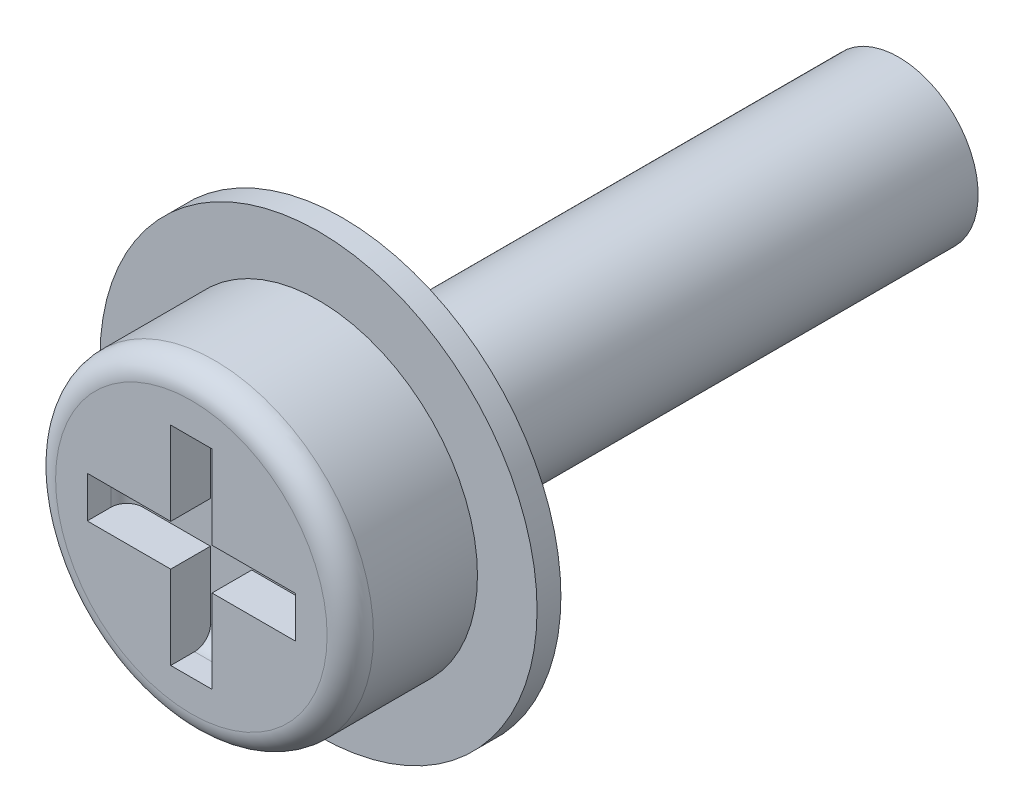
ISO-10303-21;
HEADER;
FILE_DESCRIPTION(('STEP AP214'),'2;1');
FILE_NAME('part.step','',(''),(''),'','','');
FILE_SCHEMA(('AUTOMOTIVE_DESIGN { 1 0 10303 214 1 1 1 1 }'));
ENDSEC;
DATA;
#1=APPLICATION_CONTEXT('core data for automotive mechanical design processes');
#2=APPLICATION_PROTOCOL_DEFINITION('international standard','automotive_design',2000,#1);
#3=PRODUCT_CONTEXT('',#1,'mechanical');
#4=PRODUCT('Part','Part','',(#3));
#5=PRODUCT_RELATED_PRODUCT_CATEGORY('part','',(#4));
#6=PRODUCT_DEFINITION_FORMATION('','',#4);
#7=PRODUCT_DEFINITION_CONTEXT('part definition',#1,'design');
#8=PRODUCT_DEFINITION('design','',#6,#7);
#9=PRODUCT_DEFINITION_SHAPE('','',#8);
#10=(LENGTH_UNIT() NAMED_UNIT(*) SI_UNIT(.MILLI.,.METRE.));
#11=(NAMED_UNIT(*) PLANE_ANGLE_UNIT() SI_UNIT($,.RADIAN.));
#12=(NAMED_UNIT(*) SI_UNIT($,.STERADIAN.) SOLID_ANGLE_UNIT());
#13=UNCERTAINTY_MEASURE_WITH_UNIT(LENGTH_MEASURE(1.E-05),#10,'distance_accuracy_value','');
#14=(GEOMETRIC_REPRESENTATION_CONTEXT(3) GLOBAL_UNCERTAINTY_ASSIGNED_CONTEXT((#13)) GLOBAL_UNIT_ASSIGNED_CONTEXT((#10,
#11,#12)) REPRESENTATION_CONTEXT('',''));
#15=CARTESIAN_POINT('',(0.,0.,0.));
#16=DIRECTION('',(0.,0.,1.));
#17=DIRECTION('',(1.,0.,0.));
#18=AXIS2_PLACEMENT_3D('',#15,#16,#17);
#19=CARTESIAN_POINT('',(0.,0.,0.36));
#20=DIRECTION('',(0.,0.,-1.));
#21=DIRECTION('',(-1.,0.,0.));
#22=AXIS2_PLACEMENT_3D('',#19,#20,#21);
#23=CYLINDRICAL_SURFACE('',#22,3.3);
#24=CARTESIAN_POINT('',(0.,0.,0.36));
#25=DIRECTION('',(0.,0.,1.));
#26=DIRECTION('',(1.,0.,0.));
#27=AXIS2_PLACEMENT_3D('',#24,#25,#26);
#28=CIRCLE('',#27,3.3);
#29=CARTESIAN_POINT('',(-3.3,0.,0.36));
#30=VERTEX_POINT('',#29);
#31=EDGE_CURVE('E256',#30,#30,#28,.T.);
#32=CARTESIAN_POINT('',(0.,0.,0.));
#33=DIRECTION('',(0.,0.,1.));
#34=DIRECTION('',(1.,0.,0.));
#35=AXIS2_PLACEMENT_3D('',#32,#33,#34);
#36=CIRCLE('',#35,3.3);
#37=CARTESIAN_POINT('',(-3.3,0.,0.));
#38=VERTEX_POINT('',#37);
#39=EDGE_CURVE('E248',#38,#38,#36,.T.);
#40=CARTESIAN_POINT('',(-3.3,0.,0.36));
#41=CARTESIAN_POINT('',(-3.3,0.,0.35625));
#42=CARTESIAN_POINT('',(-3.3,0.,0.3525));
#43=CARTESIAN_POINT('',(-3.3,0.,0.345));
#44=CARTESIAN_POINT('',(-3.3,0.,0.34125));
#45=CARTESIAN_POINT('',(-3.3,0.,0.33375));
#46=CARTESIAN_POINT('',(-3.3,0.,0.33));
#47=CARTESIAN_POINT('',(-3.3,0.,0.3225));
#48=CARTESIAN_POINT('',(-3.3,0.,0.31875));
#49=CARTESIAN_POINT('',(-3.3,0.,0.31125));
#50=CARTESIAN_POINT('',(-3.3,0.,0.3075));
#51=CARTESIAN_POINT('',(-3.3,0.,0.3));
#52=CARTESIAN_POINT('',(-3.3,0.,0.29625));
#53=CARTESIAN_POINT('',(-3.3,0.,0.28875));
#54=CARTESIAN_POINT('',(-3.3,0.,0.285));
#55=CARTESIAN_POINT('',(-3.3,0.,0.2775));
#56=CARTESIAN_POINT('',(-3.3,0.,0.27375));
#57=CARTESIAN_POINT('',(-3.3,0.,0.26625));
#58=CARTESIAN_POINT('',(-3.3,0.,0.2625));
#59=CARTESIAN_POINT('',(-3.3,0.,0.255));
#60=CARTESIAN_POINT('',(-3.3,0.,0.25125));
#61=CARTESIAN_POINT('',(-3.3,0.,0.24375));
#62=CARTESIAN_POINT('',(-3.3,0.,0.24));
#63=CARTESIAN_POINT('',(-3.3,0.,0.2325));
#64=CARTESIAN_POINT('',(-3.3,0.,0.22875));
#65=CARTESIAN_POINT('',(-3.3,0.,0.22125));
#66=CARTESIAN_POINT('',(-3.3,0.,0.2175));
#67=CARTESIAN_POINT('',(-3.3,0.,0.21));
#68=CARTESIAN_POINT('',(-3.3,0.,0.20625));
#69=CARTESIAN_POINT('',(-3.3,0.,0.19875));
#70=CARTESIAN_POINT('',(-3.3,0.,0.195));
#71=CARTESIAN_POINT('',(-3.3,0.,0.1875));
#72=CARTESIAN_POINT('',(-3.3,0.,0.18375));
#73=CARTESIAN_POINT('',(-3.3,0.,0.17625));
#74=CARTESIAN_POINT('',(-3.3,0.,0.1725));
#75=CARTESIAN_POINT('',(-3.3,0.,0.165));
#76=CARTESIAN_POINT('',(-3.3,0.,0.16125));
#77=CARTESIAN_POINT('',(-3.3,0.,0.15375));
#78=CARTESIAN_POINT('',(-3.3,0.,0.15));
#79=CARTESIAN_POINT('',(-3.3,0.,0.1425));
#80=CARTESIAN_POINT('',(-3.3,0.,0.13875));
#81=CARTESIAN_POINT('',(-3.3,0.,0.13125));
#82=CARTESIAN_POINT('',(-3.3,0.,0.1275));
#83=CARTESIAN_POINT('',(-3.3,0.,0.12));
#84=CARTESIAN_POINT('',(-3.3,0.,0.11625));
#85=CARTESIAN_POINT('',(-3.3,0.,0.10875));
#86=CARTESIAN_POINT('',(-3.3,0.,0.105));
#87=CARTESIAN_POINT('',(-3.3,0.,0.0974999999999999));
#88=CARTESIAN_POINT('',(-3.3,0.,0.09375));
#89=CARTESIAN_POINT('',(-3.3,0.,0.08625));
#90=CARTESIAN_POINT('',(-3.3,0.,0.0825));
#91=CARTESIAN_POINT('',(-3.3,0.,0.075));
#92=CARTESIAN_POINT('',(-3.3,0.,0.07125));
#93=CARTESIAN_POINT('',(-3.3,0.,0.0637499999999999));
#94=CARTESIAN_POINT('',(-3.3,0.,0.0599999999999999));
#95=CARTESIAN_POINT('',(-3.3,0.,0.0524999999999999));
#96=CARTESIAN_POINT('',(-3.3,0.,0.0487499999999999));
#97=CARTESIAN_POINT('',(-3.3,0.,0.04125));
#98=CARTESIAN_POINT('',(-3.3,0.,0.0375));
#99=CARTESIAN_POINT('',(-3.3,0.,0.03));
#100=CARTESIAN_POINT('',(-3.3,0.,0.02625));
#101=CARTESIAN_POINT('',(-3.3,0.,0.0187499999999999));
#102=CARTESIAN_POINT('',(-3.3,0.,0.0149999999999999));
#103=CARTESIAN_POINT('',(-3.3,0.,0.00749999999999993));
#104=CARTESIAN_POINT('',(-3.3,0.,0.00374999999999994));
#105=CARTESIAN_POINT('',(-3.3,0.,0.));
#106=B_SPLINE_CURVE_WITH_KNOTS('',3,(#40,#41,#42,#43,#44,#45,#46,#47,#48,#49,#50,#51,#52,#53,
#54,#55,#56,#57,#58,#59,#60,#61,#62,#63,#64,#65,#66,#67,#68,#69,#70,#71,#72,#73,#74,#75,#76,#77,
#78,#79,#80,#81,#82,#83,#84,#85,#86,#87,#88,#89,#90,#91,#92,#93,#94,#95,#96,#97,#98,#99,#100,
#101,#102,#103,#104,#105),.UNSPECIFIED.,.F.,.F.,(4,2,2,2,2,2,2,2,2,2,2,2,2,2,2,2,2,2,2,2,2,2,2,
2,2,2,2,2,2,2,2,2,4),(0.,0.01125,0.0225,0.03375,0.045,0.05625,0.0675,0.07875,0.09,0.10125,
0.1125,0.12375,0.135,0.14625,0.1575,0.16875,0.18,0.19125,0.2025,0.21375,0.225,0.23625,0.2475,
0.25875,0.27,0.28125,0.2925,0.30375,0.315,0.32625,0.3375,0.34875,0.36),.UNSPECIFIED.);
#107=EDGE_CURVE('BSEAM37',#30,#38,#106,.T.);
#108=ORIENTED_EDGE('',*,*,#31,.F.);
#109=ORIENTED_EDGE('',*,*,#39,.T.);
#110=ORIENTED_EDGE('',*,*,#107,.T.);
#111=ORIENTED_EDGE('',*,*,#107,.F.);
#112=EDGE_LOOP('',(#108,#110,#109,#111));
#113=FACE_BOUND('',#112,.T.);
#114=ADVANCED_FACE('F37',(#113),#23,.T.);
#115=CARTESIAN_POINT('',(0.,0.,0.36));
#116=DIRECTION('',(0.,0.,1.));
#117=DIRECTION('',(1.,0.,0.));
#118=AXIS2_PLACEMENT_3D('',#115,#116,#117);
#119=PLANE('',#118);
#120=CARTESIAN_POINT('',(0.,0.,0.36));
#121=DIRECTION('',(0.,0.,1.));
#122=DIRECTION('',(1.,0.,0.));
#123=AXIS2_PLACEMENT_3D('',#120,#121,#122);
#124=CIRCLE('',#123,2.4);
#125=CARTESIAN_POINT('',(2.4,0.,0.36));
#126=VERTEX_POINT('',#125);
#127=EDGE_CURVE('E253',#126,#126,#124,.T.);
#128=ORIENTED_EDGE('',*,*,#127,.F.);
#129=EDGE_LOOP('',(#128));
#130=FACE_BOUND('',#129,.T.);
#131=ORIENTED_EDGE('',*,*,#31,.T.);
#132=EDGE_LOOP('',(#131));
#133=FACE_BOUND('',#132,.T.);
#134=ADVANCED_FACE('F317',(#130,#133),#119,.T.);
#135=CARTESIAN_POINT('',(0.,0.,0.));
#136=DIRECTION('',(0.,0.,1.));
#137=DIRECTION('',(1.,0.,0.));
#138=AXIS2_PLACEMENT_3D('',#135,#136,#137);
#139=PLANE('',#138);
#140=CARTESIAN_POINT('',(0.,0.,0.));
#141=DIRECTION('',(0.,0.,-1.));
#142=DIRECTION('',(-1.,0.,0.));
#143=AXIS2_PLACEMENT_3D('',#140,#141,#142);
#144=CIRCLE('',#143,1.2);
#145=CARTESIAN_POINT('',(-1.2,0.,0.));
#146=VERTEX_POINT('',#145);
#147=EDGE_CURVE('E249',#146,#146,#144,.T.);
#148=ORIENTED_EDGE('',*,*,#147,.F.);
#149=EDGE_LOOP('',(#148));
#150=FACE_BOUND('',#149,.T.);
#151=ORIENTED_EDGE('',*,*,#39,.F.);
#152=EDGE_LOOP('',(#151));
#153=FACE_BOUND('',#152,.T.);
#154=ADVANCED_FACE('F323',(#150,#153),#139,.F.);
#155=CARTESIAN_POINT('',(0.,0.,2.28));
#156=DIRECTION('',(0.,0.,-1.));
#157=DIRECTION('',(-1.,0.,0.));
#158=AXIS2_PLACEMENT_3D('',#155,#156,#157);
#159=CYLINDRICAL_SURFACE('',#158,2.4);
#160=CARTESIAN_POINT('',(0.,0.,1.93));
#161=DIRECTION('',(0.,0.,1.));
#162=DIRECTION('',(1.,0.,0.));
#163=AXIS2_PLACEMENT_3D('',#160,#161,#162);
#164=CIRCLE('',#163,2.4);
#165=CARTESIAN_POINT('',(2.4,0.,1.93));
#166=VERTEX_POINT('',#165);
#167=EDGE_CURVE('E263',#166,#166,#164,.F.);
#168=ORIENTED_EDGE('',*,*,#167,.T.);
#169=EDGE_LOOP('',(#168));
#170=FACE_BOUND('',#169,.T.);
#171=ORIENTED_EDGE('',*,*,#127,.T.);
#172=EDGE_LOOP('',(#171));
#173=FACE_BOUND('',#172,.T.);
#174=ADVANCED_FACE('F410',(#170,#173),#159,.T.);
#175=CARTESIAN_POINT('',(0.,0.,2.28));
#176=DIRECTION('',(0.,0.,1.));
#177=DIRECTION('',(1.,0.,0.));
#178=AXIS2_PLACEMENT_3D('',#175,#176,#177);
#179=PLANE('',#178);
#180=DIRECTION('',(0.,-1.,0.));
#181=VECTOR('',#180,1.);
#182=CARTESIAN_POINT('',(-0.312,-0.312,2.28));
#183=LINE('',#182,#181);
#184=CARTESIAN_POINT('',(-0.312,-0.312,2.28));
#185=VERTEX_POINT('',#184);
#186=CARTESIAN_POINT('',(-0.312,-1.572,2.28));
#187=VERTEX_POINT('',#186);
#188=EDGE_CURVE('E193',#185,#187,#183,.T.);
#189=ORIENTED_EDGE('',*,*,#188,.F.);
#190=DIRECTION('',(1.,0.,0.));
#191=VECTOR('',#190,1.);
#192=CARTESIAN_POINT('',(-1.572,-0.312,2.28));
#193=LINE('',#192,#191);
#194=CARTESIAN_POINT('',(-1.572,-0.312,2.28));
#195=VERTEX_POINT('',#194);
#196=EDGE_CURVE('E223',#195,#185,#193,.T.);
#197=ORIENTED_EDGE('',*,*,#196,.F.);
#198=DIRECTION('',(0.,-1.,0.));
#199=VECTOR('',#198,1.);
#200=CARTESIAN_POINT('',(-1.572,-0.312,2.28));
#201=LINE('',#200,#199);
#202=CARTESIAN_POINT('',(-1.572,0.312,2.28));
#203=VERTEX_POINT('',#202);
#204=EDGE_CURVE('E220',#203,#195,#201,.T.);
#205=ORIENTED_EDGE('',*,*,#204,.F.);
#206=DIRECTION('',(-1.,0.,0.));
#207=VECTOR('',#206,1.);
#208=CARTESIAN_POINT('',(-1.572,0.312,2.28));
#209=LINE('',#208,#207);
#210=CARTESIAN_POINT('',(-0.312,0.312,2.28));
#211=VERTEX_POINT('',#210);
#212=EDGE_CURVE('E217',#211,#203,#209,.T.);
#213=ORIENTED_EDGE('',*,*,#212,.F.);
#214=DIRECTION('',(0.,-1.,0.));
#215=VECTOR('',#214,1.);
#216=CARTESIAN_POINT('',(-0.312,0.312,2.28));
#217=LINE('',#216,#215);
#218=CARTESIAN_POINT('',(-0.312,1.572,2.28));
#219=VERTEX_POINT('',#218);
#220=EDGE_CURVE('E214',#219,#211,#217,.T.);
#221=ORIENTED_EDGE('',*,*,#220,.F.);
#222=DIRECTION('',(-1.,0.,0.));
#223=VECTOR('',#222,1.);
#224=CARTESIAN_POINT('',(-0.312,1.572,2.28));
#225=LINE('',#224,#223);
#226=CARTESIAN_POINT('',(0.312000000000001,1.572,2.28));
#227=VERTEX_POINT('',#226);
#228=EDGE_CURVE('E211',#227,#219,#225,.T.);
#229=ORIENTED_EDGE('',*,*,#228,.F.);
#230=DIRECTION('',(0.,1.,0.));
#231=VECTOR('',#230,1.);
#232=CARTESIAN_POINT('',(0.312000000000001,0.312,2.28));
#233=LINE('',#232,#231);
#234=CARTESIAN_POINT('',(0.312000000000001,0.312,2.28));
#235=VERTEX_POINT('',#234);
#236=EDGE_CURVE('E208',#235,#227,#233,.T.);
#237=ORIENTED_EDGE('',*,*,#236,.F.);
#238=DIRECTION('',(-1.,0.,0.));
#239=VECTOR('',#238,1.);
#240=CARTESIAN_POINT('',(1.572,0.312,2.28));
#241=LINE('',#240,#239);
#242=CARTESIAN_POINT('',(1.572,0.312,2.28));
#243=VERTEX_POINT('',#242);
#244=EDGE_CURVE('E205',#243,#235,#241,.T.);
#245=ORIENTED_EDGE('',*,*,#244,.F.);
#246=DIRECTION('',(0.,1.,0.));
#247=VECTOR('',#246,1.);
#248=CARTESIAN_POINT('',(1.572,-0.312,2.28));
#249=LINE('',#248,#247);
#250=CARTESIAN_POINT('',(1.572,-0.312,2.28));
#251=VERTEX_POINT('',#250);
#252=EDGE_CURVE('E202',#251,#243,#249,.T.);
#253=ORIENTED_EDGE('',*,*,#252,.F.);
#254=DIRECTION('',(1.,0.,0.));
#255=VECTOR('',#254,1.);
#256=CARTESIAN_POINT('',(1.572,-0.312,2.28));
#257=LINE('',#256,#255);
#258=CARTESIAN_POINT('',(0.312000000000001,-0.312,2.28));
#259=VERTEX_POINT('',#258);
#260=EDGE_CURVE('E200',#259,#251,#257,.T.);
#261=ORIENTED_EDGE('',*,*,#260,.F.);
#262=DIRECTION('',(0.,1.,0.));
#263=VECTOR('',#262,1.);
#264=CARTESIAN_POINT('',(0.312000000000001,-0.312,2.28));
#265=LINE('',#264,#263);
#266=CARTESIAN_POINT('',(0.312000000000001,-1.572,2.28));
#267=VERTEX_POINT('',#266);
#268=EDGE_CURVE('E166',#267,#259,#265,.T.);
#269=ORIENTED_EDGE('',*,*,#268,.F.);
#270=DIRECTION('',(1.,0.,0.));
#271=VECTOR('',#270,1.);
#272=CARTESIAN_POINT('',(-0.312,-1.572,2.28));
#273=LINE('',#272,#271);
#274=EDGE_CURVE('E196',#187,#267,#273,.T.);
#275=ORIENTED_EDGE('',*,*,#274,.F.);
#276=EDGE_LOOP('',(#189,#197,#205,#213,#221,#229,#237,#245,#253,#261,#269,#275));
#277=FACE_BOUND('',#276,.T.);
#278=CARTESIAN_POINT('',(0.,0.,2.28));
#279=DIRECTION('',(0.,0.,1.));
#280=DIRECTION('',(1.,0.,0.));
#281=AXIS2_PLACEMENT_3D('',#278,#279,#280);
#282=CIRCLE('',#281,2.05);
#283=CARTESIAN_POINT('',(2.05,0.,2.28));
#284=VERTEX_POINT('',#283);
#285=EDGE_CURVE('E252',#284,#284,#282,.T.);
#286=ORIENTED_EDGE('',*,*,#285,.T.);
#287=EDGE_LOOP('',(#286));
#288=FACE_BOUND('',#287,.T.);
#289=ADVANCED_FACE('F360',(#277,#288),#179,.T.);
#290=CARTESIAN_POINT('',(0.,0.,-8.4));
#291=DIRECTION('',(0.,0.,1.));
#292=DIRECTION('',(1.,0.,0.));
#293=AXIS2_PLACEMENT_3D('',#290,#291,#292);
#294=CYLINDRICAL_SURFACE('',#293,1.2);
#295=CARTESIAN_POINT('',(0.,0.,-8.4));
#296=DIRECTION('',(0.,0.,-1.));
#297=DIRECTION('',(-1.,0.,0.));
#298=AXIS2_PLACEMENT_3D('',#295,#296,#297);
#299=CIRCLE('',#298,1.2);
#300=CARTESIAN_POINT('',(-1.2,0.,-8.4));
#301=VERTEX_POINT('',#300);
#302=EDGE_CURVE('E228',#301,#301,#299,.T.);
#303=ORIENTED_EDGE('',*,*,#302,.F.);
#304=EDGE_LOOP('',(#303));
#305=FACE_BOUND('',#304,.T.);
#306=ORIENTED_EDGE('',*,*,#147,.T.);
#307=EDGE_LOOP('',(#306));
#308=FACE_BOUND('',#307,.T.);
#309=ADVANCED_FACE('F403',(#305,#308),#294,.T.);
#310=CARTESIAN_POINT('',(0.,0.,-8.4));
#311=DIRECTION('',(0.,0.,-1.));
#312=DIRECTION('',(-1.,0.,0.));
#313=AXIS2_PLACEMENT_3D('',#310,#311,#312);
#314=PLANE('',#313);
#315=ORIENTED_EDGE('',*,*,#302,.T.);
#316=EDGE_LOOP('',(#315));
#317=FACE_BOUND('',#316,.T.);
#318=ADVANCED_FACE('F334',(#317),#314,.T.);
#319=CARTESIAN_POINT('',(0.,0.,1.93));
#320=DIRECTION('',(0.,0.,1.));
#321=DIRECTION('',(1.,0.,0.));
#322=AXIS2_PLACEMENT_3D('',#319,#320,#321);
#323=TOROIDAL_SURFACE('',#322,2.05,0.35);
#324=ORIENTED_EDGE('',*,*,#167,.F.);
#325=EDGE_LOOP('',(#324));
#326=FACE_BOUND('',#325,.T.);
#327=ORIENTED_EDGE('',*,*,#285,.F.);
#328=EDGE_LOOP('',(#327));
#329=FACE_BOUND('',#328,.T.);
#330=ADVANCED_FACE('F330',(#326,#329),#323,.T.);
#331=CARTESIAN_POINT('',(-0.312,-0.312,1.68));
#332=DIRECTION('',(-1.,0.,0.));
#333=DIRECTION('',(0.,0.,1.));
#334=AXIS2_PLACEMENT_3D('',#331,#332,#333);
#335=PLANE('',#334);
#336=DIRECTION('',(0.,0.,1.));
#337=VECTOR('',#336,1.);
#338=CARTESIAN_POINT('',(-0.312,-1.572,1.68));
#339=LINE('',#338,#337);
#340=CARTESIAN_POINT('',(-0.312,-1.572,1.92));
#341=VERTEX_POINT('',#340);
#342=EDGE_CURVE('E192',#341,#187,#339,.T.);
#343=ORIENTED_EDGE('',*,*,#342,.F.);
#344=CARTESIAN_POINT('',(-0.312,-1.332,1.92));
#345=DIRECTION('',(-1.,0.,0.));
#346=DIRECTION('',(0.,0.,1.));
#347=AXIS2_PLACEMENT_3D('',#344,#345,#346);
#348=CIRCLE('',#347,0.24);
#349=CARTESIAN_POINT('',(-0.312,-1.332,1.68));
#350=VERTEX_POINT('',#349);
#351=EDGE_CURVE('E279',#341,#350,#348,.F.);
#352=ORIENTED_EDGE('',*,*,#351,.T.);
#353=DIRECTION('',(0.,-1.,0.));
#354=VECTOR('',#353,1.);
#355=CARTESIAN_POINT('',(-0.312,-0.312,1.68));
#356=LINE('',#355,#354);
#357=CARTESIAN_POINT('',(-0.312,-0.312,1.68));
#358=VERTEX_POINT('',#357);
#359=EDGE_CURVE('E160',#358,#350,#356,.T.);
#360=ORIENTED_EDGE('',*,*,#359,.F.);
#361=DIRECTION('',(0.,0.,1.));
#362=VECTOR('',#361,1.);
#363=CARTESIAN_POINT('',(-0.312,-0.312,1.68));
#364=LINE('',#363,#362);
#365=EDGE_CURVE('E226',#358,#185,#364,.T.);
#366=ORIENTED_EDGE('',*,*,#365,.T.);
#367=ORIENTED_EDGE('',*,*,#188,.T.);
#368=EDGE_LOOP('',(#343,#352,#360,#366,#367));
#369=FACE_BOUND('',#368,.T.);
#370=ADVANCED_FACE('F333',(#369),#335,.F.);
#371=CARTESIAN_POINT('',(-1.572,-0.312,1.68));
#372=DIRECTION('',(0.,-1.,0.));
#373=DIRECTION('',(1.,0.,0.));
#374=AXIS2_PLACEMENT_3D('',#371,#372,#373);
#375=PLANE('',#374);
#376=DIRECTION('',(1.,0.,0.));
#377=VECTOR('',#376,1.);
#378=CARTESIAN_POINT('',(-1.572,-0.312,1.68));
#379=LINE('',#378,#377);
#380=CARTESIAN_POINT('',(-1.332,-0.312,1.68));
#381=VERTEX_POINT('',#380);
#382=EDGE_CURVE('E190',#381,#358,#379,.T.);
#383=ORIENTED_EDGE('',*,*,#382,.F.);
#384=CARTESIAN_POINT('',(-1.332,-0.312,1.92));
#385=DIRECTION('',(0.,-1.,0.));
#386=DIRECTION('',(1.,0.,0.));
#387=AXIS2_PLACEMENT_3D('',#384,#385,#386);
#388=CIRCLE('',#387,0.24);
#389=CARTESIAN_POINT('',(-1.572,-0.312,1.92));
#390=VERTEX_POINT('',#389);
#391=EDGE_CURVE('E281',#381,#390,#388,.F.);
#392=ORIENTED_EDGE('',*,*,#391,.T.);
#393=DIRECTION('',(0.,0.,1.));
#394=VECTOR('',#393,1.);
#395=CARTESIAN_POINT('',(-1.572,-0.312,1.68));
#396=LINE('',#395,#394);
#397=EDGE_CURVE('E229',#390,#195,#396,.T.);
#398=ORIENTED_EDGE('',*,*,#397,.T.);
#399=ORIENTED_EDGE('',*,*,#196,.T.);
#400=ORIENTED_EDGE('',*,*,#365,.F.);
#401=EDGE_LOOP('',(#383,#392,#398,#399,#400));
#402=FACE_BOUND('',#401,.T.);
#403=ADVANCED_FACE('F366',(#402),#375,.F.);
#404=CARTESIAN_POINT('',(-1.572,-0.312,1.68));
#405=DIRECTION('',(-1.,0.,0.));
#406=DIRECTION('',(0.,0.,1.));
#407=AXIS2_PLACEMENT_3D('',#404,#405,#406);
#408=PLANE('',#407);
#409=ORIENTED_EDGE('',*,*,#397,.F.);
#410=DIRECTION('',(0.,-1.,0.));
#411=VECTOR('',#410,1.);
#412=CARTESIAN_POINT('',(-1.572,-0.312,1.92));
#413=LINE('',#412,#411);
#414=CARTESIAN_POINT('',(-1.572,0.312,1.92));
#415=VERTEX_POINT('',#414);
#416=EDGE_CURVE('E283',#390,#415,#413,.F.);
#417=ORIENTED_EDGE('',*,*,#416,.T.);
#418=DIRECTION('',(0.,0.,1.));
#419=VECTOR('',#418,1.);
#420=CARTESIAN_POINT('',(-1.572,0.312,1.68));
#421=LINE('',#420,#419);
#422=EDGE_CURVE('E231',#415,#203,#421,.T.);
#423=ORIENTED_EDGE('',*,*,#422,.T.);
#424=ORIENTED_EDGE('',*,*,#204,.T.);
#425=EDGE_LOOP('',(#409,#417,#423,#424));
#426=FACE_BOUND('',#425,.T.);
#427=ADVANCED_FACE('F364',(#426),#408,.F.);
#428=CARTESIAN_POINT('',(-1.572,0.312,1.68));
#429=DIRECTION('',(0.,1.,0.));
#430=DIRECTION('',(-1.,0.,0.));
#431=AXIS2_PLACEMENT_3D('',#428,#429,#430);
#432=PLANE('',#431);
#433=ORIENTED_EDGE('',*,*,#422,.F.);
#434=CARTESIAN_POINT('',(-1.332,0.312,1.92));
#435=DIRECTION('',(0.,1.,0.));
#436=DIRECTION('',(-1.,0.,0.));
#437=AXIS2_PLACEMENT_3D('',#434,#435,#436);
#438=CIRCLE('',#437,0.24);
#439=CARTESIAN_POINT('',(-1.332,0.312,1.68));
#440=VERTEX_POINT('',#439);
#441=EDGE_CURVE('E285',#415,#440,#438,.F.);
#442=ORIENTED_EDGE('',*,*,#441,.T.);
#443=DIRECTION('',(-1.,0.,0.));
#444=VECTOR('',#443,1.);
#445=CARTESIAN_POINT('',(-1.572,0.312,1.68));
#446=LINE('',#445,#444);
#447=CARTESIAN_POINT('',(-0.312,0.312,1.68));
#448=VERTEX_POINT('',#447);
#449=EDGE_CURVE('E187',#448,#440,#446,.T.);
#450=ORIENTED_EDGE('',*,*,#449,.F.);
#451=DIRECTION('',(0.,0.,1.));
#452=VECTOR('',#451,1.);
#453=CARTESIAN_POINT('',(-0.312,0.312,1.68));
#454=LINE('',#453,#452);
#455=EDGE_CURVE('E233',#448,#211,#454,.T.);
#456=ORIENTED_EDGE('',*,*,#455,.T.);
#457=ORIENTED_EDGE('',*,*,#212,.T.);
#458=EDGE_LOOP('',(#433,#442,#450,#456,#457));
#459=FACE_BOUND('',#458,.T.);
#460=ADVANCED_FACE('F350',(#459),#432,.F.);
#461=CARTESIAN_POINT('',(-0.312,0.312,1.68));
#462=DIRECTION('',(-1.,0.,0.));
#463=DIRECTION('',(0.,0.,1.));
#464=AXIS2_PLACEMENT_3D('',#461,#462,#463);
#465=PLANE('',#464);
#466=DIRECTION('',(0.,-1.,0.));
#467=VECTOR('',#466,1.);
#468=CARTESIAN_POINT('',(-0.312,0.312,1.68));
#469=LINE('',#468,#467);
#470=CARTESIAN_POINT('',(-0.312,1.332,1.68));
#471=VERTEX_POINT('',#470);
#472=EDGE_CURVE('E185',#471,#448,#469,.T.);
#473=ORIENTED_EDGE('',*,*,#472,.F.);
#474=CARTESIAN_POINT('',(-0.312,1.332,1.92));
#475=DIRECTION('',(-1.,0.,0.));
#476=DIRECTION('',(0.,0.,1.));
#477=AXIS2_PLACEMENT_3D('',#474,#475,#476);
#478=CIRCLE('',#477,0.24);
#479=CARTESIAN_POINT('',(-0.312,1.572,1.92));
#480=VERTEX_POINT('',#479);
#481=EDGE_CURVE('E59',#471,#480,#478,.F.);
#482=ORIENTED_EDGE('',*,*,#481,.T.);
#483=DIRECTION('',(0.,0.,1.));
#484=VECTOR('',#483,1.);
#485=CARTESIAN_POINT('',(-0.312,1.572,1.68));
#486=LINE('',#485,#484);
#487=EDGE_CURVE('E235',#480,#219,#486,.T.);
#488=ORIENTED_EDGE('',*,*,#487,.T.);
#489=ORIENTED_EDGE('',*,*,#220,.T.);
#490=ORIENTED_EDGE('',*,*,#455,.F.);
#491=EDGE_LOOP('',(#473,#482,#488,#489,#490));
#492=FACE_BOUND('',#491,.T.);
#493=ADVANCED_FACE('F353',(#492),#465,.F.);
#494=CARTESIAN_POINT('',(-0.312,1.572,1.68));
#495=DIRECTION('',(0.,1.,0.));
#496=DIRECTION('',(0.,0.,1.));
#497=AXIS2_PLACEMENT_3D('',#494,#495,#496);
#498=PLANE('',#497);
#499=ORIENTED_EDGE('',*,*,#487,.F.);
#500=DIRECTION('',(-1.,0.,0.));
#501=VECTOR('',#500,1.);
#502=CARTESIAN_POINT('',(-0.312,1.572,1.92));
#503=LINE('',#502,#501);
#504=CARTESIAN_POINT('',(0.312000000000001,1.572,1.92));
#505=VERTEX_POINT('',#504);
#506=EDGE_CURVE('E45',#480,#505,#503,.F.);
#507=ORIENTED_EDGE('',*,*,#506,.T.);
#508=DIRECTION('',(0.,0.,1.));
#509=VECTOR('',#508,1.);
#510=CARTESIAN_POINT('',(0.312000000000001,1.572,1.68));
#511=LINE('',#510,#509);
#512=EDGE_CURVE('E237',#505,#227,#511,.T.);
#513=ORIENTED_EDGE('',*,*,#512,.T.);
#514=ORIENTED_EDGE('',*,*,#228,.T.);
#515=EDGE_LOOP('',(#499,#507,#513,#514));
#516=FACE_BOUND('',#515,.T.);
#517=ADVANCED_FACE('F378',(#516),#498,.F.);
#518=CARTESIAN_POINT('',(0.312000000000001,0.312,1.68));
#519=DIRECTION('',(1.,0.,0.));
#520=DIRECTION('',(0.,1.,0.));
#521=AXIS2_PLACEMENT_3D('',#518,#519,#520);
#522=PLANE('',#521);
#523=ORIENTED_EDGE('',*,*,#512,.F.);
#524=CARTESIAN_POINT('',(0.312000000000001,1.332,1.92));
#525=DIRECTION('',(1.,0.,0.));
#526=DIRECTION('',(0.,1.,0.));
#527=AXIS2_PLACEMENT_3D('',#524,#525,#526);
#528=CIRCLE('',#527,0.24);
#529=CARTESIAN_POINT('',(0.312000000000001,1.332,1.68));
#530=VERTEX_POINT('',#529);
#531=EDGE_CURVE('E11',#505,#530,#528,.F.);
#532=ORIENTED_EDGE('',*,*,#531,.T.);
#533=DIRECTION('',(0.,1.,0.));
#534=VECTOR('',#533,1.);
#535=CARTESIAN_POINT('',(0.312000000000001,0.312,1.68));
#536=LINE('',#535,#534);
#537=CARTESIAN_POINT('',(0.312000000000001,0.312,1.68));
#538=VERTEX_POINT('',#537);
#539=EDGE_CURVE('E179',#538,#530,#536,.T.);
#540=ORIENTED_EDGE('',*,*,#539,.F.);
#541=DIRECTION('',(0.,0.,1.));
#542=VECTOR('',#541,1.);
#543=CARTESIAN_POINT('',(0.312000000000001,0.312,1.68));
#544=LINE('',#543,#542);
#545=EDGE_CURVE('E239',#538,#235,#544,.T.);
#546=ORIENTED_EDGE('',*,*,#545,.T.);
#547=ORIENTED_EDGE('',*,*,#236,.T.);
#548=EDGE_LOOP('',(#523,#532,#540,#546,#547));
#549=FACE_BOUND('',#548,.T.);
#550=ADVANCED_FACE('F307',(#549),#522,.F.);
#551=CARTESIAN_POINT('',(1.572,0.312,1.68));
#552=DIRECTION('',(0.,1.,0.));
#553=DIRECTION('',(-1.,0.,0.));
#554=AXIS2_PLACEMENT_3D('',#551,#552,#553);
#555=PLANE('',#554);
#556=DIRECTION('',(-1.,0.,0.));
#557=VECTOR('',#556,1.);
#558=CARTESIAN_POINT('',(1.572,0.312,1.68));
#559=LINE('',#558,#557);
#560=CARTESIAN_POINT('',(1.332,0.312,1.68));
#561=VERTEX_POINT('',#560);
#562=EDGE_CURVE('E177',#561,#538,#559,.T.);
#563=ORIENTED_EDGE('',*,*,#562,.F.);
#564=CARTESIAN_POINT('',(1.332,0.312,1.92));
#565=DIRECTION('',(0.,1.,0.));
#566=DIRECTION('',(-1.,0.,0.));
#567=AXIS2_PLACEMENT_3D('',#564,#565,#566);
#568=CIRCLE('',#567,0.24);
#569=CARTESIAN_POINT('',(1.572,0.312,1.92));
#570=VERTEX_POINT('',#569);
#571=EDGE_CURVE('E287',#561,#570,#568,.F.);
#572=ORIENTED_EDGE('',*,*,#571,.T.);
#573=DIRECTION('',(0.,0.,1.));
#574=VECTOR('',#573,1.);
#575=CARTESIAN_POINT('',(1.572,0.312,1.68));
#576=LINE('',#575,#574);
#577=EDGE_CURVE('E241',#570,#243,#576,.T.);
#578=ORIENTED_EDGE('',*,*,#577,.T.);
#579=ORIENTED_EDGE('',*,*,#244,.T.);
#580=ORIENTED_EDGE('',*,*,#545,.F.);
#581=EDGE_LOOP('',(#563,#572,#578,#579,#580));
#582=FACE_BOUND('',#581,.T.);
#583=ADVANCED_FACE('F302',(#582),#555,.F.);
#584=CARTESIAN_POINT('',(1.572,-0.312,1.68));
#585=DIRECTION('',(1.,0.,0.));
#586=DIRECTION('',(0.,0.,-1.));
#587=AXIS2_PLACEMENT_3D('',#584,#585,#586);
#588=PLANE('',#587);
#589=ORIENTED_EDGE('',*,*,#577,.F.);
#590=DIRECTION('',(0.,1.,0.));
#591=VECTOR('',#590,1.);
#592=CARTESIAN_POINT('',(1.572,-0.312,1.92));
#593=LINE('',#592,#591);
#594=CARTESIAN_POINT('',(1.572,-0.312,1.92));
#595=VERTEX_POINT('',#594);
#596=EDGE_CURVE('E289',#570,#595,#593,.F.);
#597=ORIENTED_EDGE('',*,*,#596,.T.);
#598=DIRECTION('',(0.,0.,1.));
#599=VECTOR('',#598,1.);
#600=CARTESIAN_POINT('',(1.572,-0.312,1.68));
#601=LINE('',#600,#599);
#602=EDGE_CURVE('E170',#595,#251,#601,.T.);
#603=ORIENTED_EDGE('',*,*,#602,.T.);
#604=ORIENTED_EDGE('',*,*,#252,.T.);
#605=EDGE_LOOP('',(#589,#597,#603,#604));
#606=FACE_BOUND('',#605,.T.);
#607=ADVANCED_FACE('F295',(#606),#588,.F.);
#608=CARTESIAN_POINT('',(1.572,-0.312,1.68));
#609=DIRECTION('',(0.,-1.,0.));
#610=DIRECTION('',(1.,0.,0.));
#611=AXIS2_PLACEMENT_3D('',#608,#609,#610);
#612=PLANE('',#611);
#613=ORIENTED_EDGE('',*,*,#602,.F.);
#614=CARTESIAN_POINT('',(1.332,-0.312,1.92));
#615=DIRECTION('',(0.,-1.,0.));
#616=DIRECTION('',(1.,0.,0.));
#617=AXIS2_PLACEMENT_3D('',#614,#615,#616);
#618=CIRCLE('',#617,0.24);
#619=CARTESIAN_POINT('',(1.332,-0.312,1.68));
#620=VERTEX_POINT('',#619);
#621=EDGE_CURVE('E176',#595,#620,#618,.F.);
#622=ORIENTED_EDGE('',*,*,#621,.T.);
#623=DIRECTION('',(1.,0.,0.));
#624=VECTOR('',#623,1.);
#625=CARTESIAN_POINT('',(1.572,-0.312,1.68));
#626=LINE('',#625,#624);
#627=CARTESIAN_POINT('',(0.312000000000001,-0.312,1.68));
#628=VERTEX_POINT('',#627);
#629=EDGE_CURVE('E155',#628,#620,#626,.T.);
#630=ORIENTED_EDGE('',*,*,#629,.F.);
#631=DIRECTION('',(0.,0.,1.));
#632=VECTOR('',#631,1.);
#633=CARTESIAN_POINT('',(0.312000000000001,-0.312,1.68));
#634=LINE('',#633,#632);
#635=EDGE_CURVE('E163',#628,#259,#634,.T.);
#636=ORIENTED_EDGE('',*,*,#635,.T.);
#637=ORIENTED_EDGE('',*,*,#260,.T.);
#638=EDGE_LOOP('',(#613,#622,#630,#636,#637));
#639=FACE_BOUND('',#638,.T.);
#640=ADVANCED_FACE('F174',(#639),#612,.F.);
#641=CARTESIAN_POINT('',(0.312000000000001,-0.312,1.68));
#642=DIRECTION('',(1.,0.,0.));
#643=DIRECTION('',(0.,1.,0.));
#644=AXIS2_PLACEMENT_3D('',#641,#642,#643);
#645=PLANE('',#644);
#646=DIRECTION('',(0.,1.,0.));
#647=VECTOR('',#646,1.);
#648=CARTESIAN_POINT('',(0.312000000000001,-0.312,1.68));
#649=LINE('',#648,#647);
#650=CARTESIAN_POINT('',(0.312000000000001,-1.332,1.68));
#651=VERTEX_POINT('',#650);
#652=EDGE_CURVE('E149',#651,#628,#649,.T.);
#653=ORIENTED_EDGE('',*,*,#652,.F.);
#654=CARTESIAN_POINT('',(0.312000000000001,-1.332,1.92));
#655=DIRECTION('',(1.,0.,0.));
#656=DIRECTION('',(0.,1.,0.));
#657=AXIS2_PLACEMENT_3D('',#654,#655,#656);
#658=CIRCLE('',#657,0.24);
#659=CARTESIAN_POINT('',(0.312000000000001,-1.572,1.92));
#660=VERTEX_POINT('',#659);
#661=EDGE_CURVE('E275',#651,#660,#658,.F.);
#662=ORIENTED_EDGE('',*,*,#661,.T.);
#663=DIRECTION('',(0.,0.,1.));
#664=VECTOR('',#663,1.);
#665=CARTESIAN_POINT('',(0.312000000000001,-1.572,1.68));
#666=LINE('',#665,#664);
#667=EDGE_CURVE('E171',#660,#267,#666,.T.);
#668=ORIENTED_EDGE('',*,*,#667,.T.);
#669=ORIENTED_EDGE('',*,*,#268,.T.);
#670=ORIENTED_EDGE('',*,*,#635,.F.);
#671=EDGE_LOOP('',(#653,#662,#668,#669,#670));
#672=FACE_BOUND('',#671,.T.);
#673=ADVANCED_FACE('F164',(#672),#645,.F.);
#674=CARTESIAN_POINT('',(-0.312,-1.572,1.68));
#675=DIRECTION('',(0.,-1.,0.));
#676=DIRECTION('',(0.,0.,-1.));
#677=AXIS2_PLACEMENT_3D('',#674,#675,#676);
#678=PLANE('',#677);
#679=ORIENTED_EDGE('',*,*,#667,.F.);
#680=DIRECTION('',(1.,0.,0.));
#681=VECTOR('',#680,1.);
#682=CARTESIAN_POINT('',(-0.312,-1.572,1.92));
#683=LINE('',#682,#681);
#684=EDGE_CURVE('E277',#660,#341,#683,.F.);
#685=ORIENTED_EDGE('',*,*,#684,.T.);
#686=ORIENTED_EDGE('',*,*,#342,.T.);
#687=ORIENTED_EDGE('',*,*,#274,.T.);
#688=EDGE_LOOP('',(#679,#685,#686,#687));
#689=FACE_BOUND('',#688,.T.);
#690=ADVANCED_FACE('F374',(#689),#678,.F.);
#691=CARTESIAN_POINT('',(0.,0.,1.68));
#692=DIRECTION('',(0.,0.,1.));
#693=DIRECTION('',(1.,0.,0.));
#694=AXIS2_PLACEMENT_3D('',#691,#692,#693);
#695=PLANE('',#694);
#696=ORIENTED_EDGE('',*,*,#359,.T.);
#697=DIRECTION('',(1.,0.,0.));
#698=VECTOR('',#697,1.);
#699=CARTESIAN_POINT('',(0.,-1.332,1.68));
#700=LINE('',#699,#698);
#701=EDGE_CURVE('E158',#350,#651,#700,.T.);
#702=ORIENTED_EDGE('',*,*,#701,.T.);
#703=ORIENTED_EDGE('',*,*,#652,.T.);
#704=ORIENTED_EDGE('',*,*,#629,.T.);
#705=DIRECTION('',(0.,1.,0.));
#706=VECTOR('',#705,1.);
#707=CARTESIAN_POINT('',(1.332,0.,1.68));
#708=LINE('',#707,#706);
#709=EDGE_CURVE('E269',#620,#561,#708,.T.);
#710=ORIENTED_EDGE('',*,*,#709,.T.);
#711=ORIENTED_EDGE('',*,*,#562,.T.);
#712=ORIENTED_EDGE('',*,*,#539,.T.);
#713=DIRECTION('',(-1.,0.,0.));
#714=VECTOR('',#713,1.);
#715=CARTESIAN_POINT('',(0.,1.332,1.68));
#716=LINE('',#715,#714);
#717=EDGE_CURVE('E266',#530,#471,#716,.T.);
#718=ORIENTED_EDGE('',*,*,#717,.T.);
#719=ORIENTED_EDGE('',*,*,#472,.T.);
#720=ORIENTED_EDGE('',*,*,#449,.T.);
#721=DIRECTION('',(0.,-1.,0.));
#722=VECTOR('',#721,1.);
#723=CARTESIAN_POINT('',(-1.332,0.,1.68));
#724=LINE('',#723,#722);
#725=EDGE_CURVE('E271',#440,#381,#724,.T.);
#726=ORIENTED_EDGE('',*,*,#725,.T.);
#727=ORIENTED_EDGE('',*,*,#382,.T.);
#728=EDGE_LOOP('',(#696,#702,#703,#704,#710,#711,#712,#718,#719,#720,#726,#727));
#729=FACE_BOUND('',#728,.T.);
#730=ADVANCED_FACE('F152',(#729),#695,.T.);
#731=CARTESIAN_POINT('',(0.,-1.332,1.92));
#732=DIRECTION('',(1.,0.,0.));
#733=DIRECTION('',(0.,0.,-1.));
#734=AXIS2_PLACEMENT_3D('',#731,#732,#733);
#735=CYLINDRICAL_SURFACE('',#734,0.24);
#736=ORIENTED_EDGE('',*,*,#351,.F.);
#737=ORIENTED_EDGE('',*,*,#684,.F.);
#738=ORIENTED_EDGE('',*,*,#661,.F.);
#739=ORIENTED_EDGE('',*,*,#701,.F.);
#740=EDGE_LOOP('',(#736,#737,#738,#739));
#741=FACE_BOUND('',#740,.T.);
#742=ADVANCED_FACE('F336',(#741),#735,.F.);
#743=CARTESIAN_POINT('',(-1.332,0.,1.92));
#744=DIRECTION('',(0.,-1.,0.));
#745=DIRECTION('',(0.,0.,-1.));
#746=AXIS2_PLACEMENT_3D('',#743,#744,#745);
#747=CYLINDRICAL_SURFACE('',#746,0.24);
#748=ORIENTED_EDGE('',*,*,#441,.F.);
#749=ORIENTED_EDGE('',*,*,#416,.F.);
#750=ORIENTED_EDGE('',*,*,#391,.F.);
#751=ORIENTED_EDGE('',*,*,#725,.F.);
#752=EDGE_LOOP('',(#748,#749,#750,#751));
#753=FACE_BOUND('',#752,.T.);
#754=ADVANCED_FACE('F315',(#753),#747,.F.);
#755=CARTESIAN_POINT('',(1.332,0.,1.92));
#756=DIRECTION('',(0.,1.,0.));
#757=DIRECTION('',(0.,0.,1.));
#758=AXIS2_PLACEMENT_3D('',#755,#756,#757);
#759=CYLINDRICAL_SURFACE('',#758,0.24);
#760=ORIENTED_EDGE('',*,*,#621,.F.);
#761=ORIENTED_EDGE('',*,*,#596,.F.);
#762=ORIENTED_EDGE('',*,*,#571,.F.);
#763=ORIENTED_EDGE('',*,*,#709,.F.);
#764=EDGE_LOOP('',(#760,#761,#762,#763));
#765=FACE_BOUND('',#764,.T.);
#766=ADVANCED_FACE('F298',(#765),#759,.F.);
#767=CARTESIAN_POINT('',(0.,1.332,1.92));
#768=DIRECTION('',(-1.,0.,0.));
#769=DIRECTION('',(0.,0.,1.));
#770=AXIS2_PLACEMENT_3D('',#767,#768,#769);
#771=CYLINDRICAL_SURFACE('',#770,0.24);
#772=ORIENTED_EDGE('',*,*,#531,.F.);
#773=ORIENTED_EDGE('',*,*,#506,.F.);
#774=ORIENTED_EDGE('',*,*,#481,.F.);
#775=ORIENTED_EDGE('',*,*,#717,.F.);
#776=EDGE_LOOP('',(#772,#773,#774,#775));
#777=FACE_BOUND('',#776,.T.);
#778=ADVANCED_FACE('F39',(#777),#771,.F.);
#779=CLOSED_SHELL('',(#114,#134,#154,#174,#289,#309,#318,#330,#370,#403,#427,#460,#493,#517,
#550,#583,#607,#640,#673,#690,#730,#742,#754,#766,#778));
#780=MANIFOLD_SOLID_BREP('B2',#779);
#781=ADVANCED_BREP_SHAPE_REPRESENTATION('',(#18,#780),#14);
#782=SHAPE_DEFINITION_REPRESENTATION(#9,#781);
ENDSEC;
END-ISO-10303-21;
